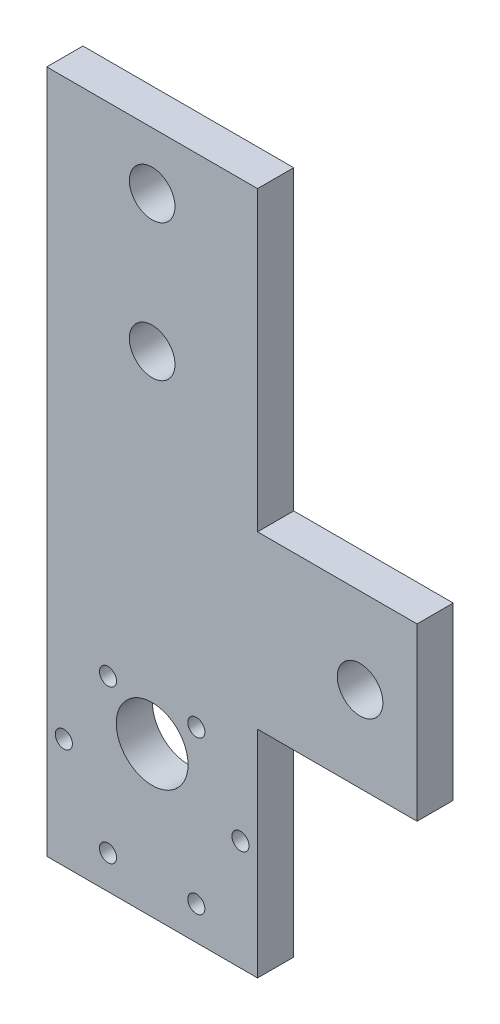
ISO-10303-21;
HEADER;
FILE_DESCRIPTION(('STEP AP214'),'2;1');
FILE_NAME('part.step','',(''),(''),'','','');
FILE_SCHEMA(('AUTOMOTIVE_DESIGN { 1 0 10303 214 1 1 1 1 }'));
ENDSEC;
DATA;
#1=APPLICATION_CONTEXT('core data for automotive mechanical design processes');
#2=APPLICATION_PROTOCOL_DEFINITION('international standard','automotive_design',2000,#1);
#3=PRODUCT_CONTEXT('',#1,'mechanical');
#4=PRODUCT('Part','Part','',(#3));
#5=PRODUCT_RELATED_PRODUCT_CATEGORY('part','',(#4));
#6=PRODUCT_DEFINITION_FORMATION('','',#4);
#7=PRODUCT_DEFINITION_CONTEXT('part definition',#1,'design');
#8=PRODUCT_DEFINITION('design','',#6,#7);
#9=PRODUCT_DEFINITION_SHAPE('','',#8);
#10=(LENGTH_UNIT() NAMED_UNIT(*) SI_UNIT(.MILLI.,.METRE.));
#11=(NAMED_UNIT(*) PLANE_ANGLE_UNIT() SI_UNIT($,.RADIAN.));
#12=(NAMED_UNIT(*) SI_UNIT($,.STERADIAN.) SOLID_ANGLE_UNIT());
#13=UNCERTAINTY_MEASURE_WITH_UNIT(LENGTH_MEASURE(1.E-05),#10,'distance_accuracy_value','');
#14=(GEOMETRIC_REPRESENTATION_CONTEXT(3) GLOBAL_UNCERTAINTY_ASSIGNED_CONTEXT((#13)) GLOBAL_UNIT_ASSIGNED_CONTEXT((#10,
#11,#12)) REPRESENTATION_CONTEXT('',''));
#15=CARTESIAN_POINT('',(0.,0.,0.));
#16=DIRECTION('',(0.,0.,1.));
#17=DIRECTION('',(1.,0.,0.));
#18=AXIS2_PLACEMENT_3D('',#15,#16,#17);
#19=CARTESIAN_POINT('',(0.,0.,6.35));
#20=DIRECTION('',(0.,0.,1.));
#21=DIRECTION('',(1.,0.,0.));
#22=AXIS2_PLACEMENT_3D('',#19,#20,#21);
#23=PLANE('',#22);
#24=CARTESIAN_POINT('',(0.,66.675,6.35));
#25=DIRECTION('',(0.,0.,1.));
#26=DIRECTION('',(1.,0.,0.));
#27=AXIS2_PLACEMENT_3D('',#24,#25,#26);
#28=CIRCLE('',#27,4.00000000000001);
#29=CARTESIAN_POINT('',(4.00000000000001,66.675,6.35));
#30=VERTEX_POINT('',#29);
#31=EDGE_CURVE('E227',#30,#30,#28,.T.);
#32=ORIENTED_EDGE('',*,*,#31,.F.);
#33=EDGE_LOOP('',(#32));
#34=FACE_BOUND('',#33,.T.);
#35=CARTESIAN_POINT('',(-15.5,0.,6.35));
#36=DIRECTION('',(0.,0.,1.));
#37=DIRECTION('',(1.,0.,0.));
#38=AXIS2_PLACEMENT_3D('',#35,#36,#37);
#39=CIRCLE('',#38,1.5);
#40=CARTESIAN_POINT('',(-14.,0.,6.35));
#41=VERTEX_POINT('',#40);
#42=EDGE_CURVE('E215',#41,#41,#39,.T.);
#43=ORIENTED_EDGE('',*,*,#42,.F.);
#44=EDGE_LOOP('',(#43));
#45=FACE_BOUND('',#44,.T.);
#46=CARTESIAN_POINT('',(7.75,-13.4233937586588,6.35));
#47=DIRECTION('',(0.,0.,1.));
#48=DIRECTION('',(1.,0.,0.));
#49=AXIS2_PLACEMENT_3D('',#46,#47,#48);
#50=CIRCLE('',#49,1.5);
#51=CARTESIAN_POINT('',(9.25,-13.4233937586588,6.35));
#52=VERTEX_POINT('',#51);
#53=EDGE_CURVE('E203',#52,#52,#50,.T.);
#54=ORIENTED_EDGE('',*,*,#53,.F.);
#55=EDGE_LOOP('',(#54));
#56=FACE_BOUND('',#55,.T.);
#57=CARTESIAN_POINT('',(7.75,13.4233937586588,6.35));
#58=DIRECTION('',(0.,0.,1.));
#59=DIRECTION('',(1.,0.,0.));
#60=AXIS2_PLACEMENT_3D('',#57,#58,#59);
#61=CIRCLE('',#60,1.5);
#62=CARTESIAN_POINT('',(9.25,13.4233937586588,6.35));
#63=VERTEX_POINT('',#62);
#64=EDGE_CURVE('E191',#63,#63,#61,.T.);
#65=ORIENTED_EDGE('',*,*,#64,.F.);
#66=EDGE_LOOP('',(#65));
#67=FACE_BOUND('',#66,.T.);
#68=CARTESIAN_POINT('',(0.,6.99999999999999,6.35));
#69=DIRECTION('',(0.,0.,1.));
#70=DIRECTION('',(1.,0.,0.));
#71=AXIS2_PLACEMENT_3D('',#68,#69,#70);
#72=CIRCLE('',#71,6.3);
#73=CARTESIAN_POINT('',(6.3,6.99999999999999,6.35));
#74=VERTEX_POINT('',#73);
#75=EDGE_CURVE('E137',#74,#74,#72,.T.);
#76=ORIENTED_EDGE('',*,*,#75,.F.);
#77=EDGE_LOOP('',(#76));
#78=FACE_BOUND('',#77,.T.);
#79=DIRECTION('',(0.,-1.,0.));
#80=VECTOR('',#79,1.);
#81=CARTESIAN_POINT('',(-18.5,100.675,6.35));
#82=LINE('',#81,#80);
#83=CARTESIAN_POINT('',(-18.5,100.675,6.35));
#84=VERTEX_POINT('',#83);
#85=CARTESIAN_POINT('',(-18.5,-19.325,6.35));
#86=VERTEX_POINT('',#85);
#87=EDGE_CURVE('E148',#84,#86,#82,.T.);
#88=ORIENTED_EDGE('',*,*,#87,.T.);
#89=DIRECTION('',(1.,0.,0.));
#90=VECTOR('',#89,1.);
#91=CARTESIAN_POINT('',(-18.5,-19.325,6.35));
#92=LINE('',#91,#90);
#93=CARTESIAN_POINT('',(18.5,-19.325,6.35));
#94=VERTEX_POINT('',#93);
#95=EDGE_CURVE('E96',#86,#94,#92,.T.);
#96=ORIENTED_EDGE('',*,*,#95,.T.);
#97=DIRECTION('',(0.,1.,0.));
#98=VECTOR('',#97,1.);
#99=CARTESIAN_POINT('',(18.5,18.5,6.35));
#100=LINE('',#99,#98);
#101=CARTESIAN_POINT('',(18.5,18.5,6.35));
#102=VERTEX_POINT('',#101);
#103=EDGE_CURVE('E163',#94,#102,#100,.T.);
#104=ORIENTED_EDGE('',*,*,#103,.T.);
#105=DIRECTION('',(1.,0.,0.));
#106=VECTOR('',#105,1.);
#107=CARTESIAN_POINT('',(18.5,18.5,6.35));
#108=LINE('',#107,#106);
#109=CARTESIAN_POINT('',(46.5,18.5,6.35));
#110=VERTEX_POINT('',#109);
#111=EDGE_CURVE('E176',#102,#110,#108,.T.);
#112=ORIENTED_EDGE('',*,*,#111,.T.);
#113=DIRECTION('',(0.,1.,0.));
#114=VECTOR('',#113,1.);
#115=CARTESIAN_POINT('',(46.5,48.5,6.35));
#116=LINE('',#115,#114);
#117=CARTESIAN_POINT('',(46.5,48.5,6.35));
#118=VERTEX_POINT('',#117);
#119=EDGE_CURVE('E115',#110,#118,#116,.T.);
#120=ORIENTED_EDGE('',*,*,#119,.T.);
#121=DIRECTION('',(-1.,0.,0.));
#122=VECTOR('',#121,1.);
#123=CARTESIAN_POINT('',(18.5,48.5,6.35));
#124=LINE('',#123,#122);
#125=CARTESIAN_POINT('',(18.5,48.5,6.35));
#126=VERTEX_POINT('',#125);
#127=EDGE_CURVE('E109',#118,#126,#124,.T.);
#128=ORIENTED_EDGE('',*,*,#127,.T.);
#129=DIRECTION('',(0.,1.,0.));
#130=VECTOR('',#129,1.);
#131=CARTESIAN_POINT('',(18.5,100.675,6.35));
#132=LINE('',#131,#130);
#133=CARTESIAN_POINT('',(18.5,100.675,6.35));
#134=VERTEX_POINT('',#133);
#135=EDGE_CURVE('E113',#126,#134,#132,.T.);
#136=ORIENTED_EDGE('',*,*,#135,.T.);
#137=DIRECTION('',(-1.,0.,0.));
#138=VECTOR('',#137,1.);
#139=CARTESIAN_POINT('',(-18.5,100.675,6.35));
#140=LINE('',#139,#138);
#141=EDGE_CURVE('E53',#134,#84,#140,.T.);
#142=ORIENTED_EDGE('',*,*,#141,.T.);
#143=EDGE_LOOP('',(#88,#96,#104,#112,#120,#128,#136,#142));
#144=FACE_BOUND('',#143,.T.);
#145=CARTESIAN_POINT('',(-7.75,13.4233937586588,6.35));
#146=DIRECTION('',(0.,0.,1.));
#147=DIRECTION('',(1.,0.,0.));
#148=AXIS2_PLACEMENT_3D('',#145,#146,#147);
#149=CIRCLE('',#148,1.5);
#150=CARTESIAN_POINT('',(-6.25,13.4233937586588,6.35));
#151=VERTEX_POINT('',#150);
#152=EDGE_CURVE('E185',#151,#151,#149,.T.);
#153=ORIENTED_EDGE('',*,*,#152,.F.);
#154=EDGE_LOOP('',(#153));
#155=FACE_BOUND('',#154,.T.);
#156=CARTESIAN_POINT('',(15.5,0.,6.35));
#157=DIRECTION('',(0.,0.,1.));
#158=DIRECTION('',(1.,0.,0.));
#159=AXIS2_PLACEMENT_3D('',#156,#157,#158);
#160=CIRCLE('',#159,1.5);
#161=CARTESIAN_POINT('',(17.,0.,6.35));
#162=VERTEX_POINT('',#161);
#163=EDGE_CURVE('E197',#162,#162,#160,.T.);
#164=ORIENTED_EDGE('',*,*,#163,.F.);
#165=EDGE_LOOP('',(#164));
#166=FACE_BOUND('',#165,.T.);
#167=CARTESIAN_POINT('',(-7.75,-13.4233937586588,6.35));
#168=DIRECTION('',(0.,0.,1.));
#169=DIRECTION('',(1.,0.,0.));
#170=AXIS2_PLACEMENT_3D('',#167,#168,#169);
#171=CIRCLE('',#170,1.5);
#172=CARTESIAN_POINT('',(-6.25,-13.4233937586588,6.35));
#173=VERTEX_POINT('',#172);
#174=EDGE_CURVE('E209',#173,#173,#171,.T.);
#175=ORIENTED_EDGE('',*,*,#174,.F.);
#176=EDGE_LOOP('',(#175));
#177=FACE_BOUND('',#176,.T.);
#178=CARTESIAN_POINT('',(0.,90.675,6.35));
#179=DIRECTION('',(0.,0.,1.));
#180=DIRECTION('',(1.,0.,0.));
#181=AXIS2_PLACEMENT_3D('',#178,#179,#180);
#182=CIRCLE('',#181,4.00000000000001);
#183=CARTESIAN_POINT('',(4.00000000000001,90.675,6.35));
#184=VERTEX_POINT('',#183);
#185=EDGE_CURVE('E221',#184,#184,#182,.T.);
#186=ORIENTED_EDGE('',*,*,#185,.F.);
#187=EDGE_LOOP('',(#186));
#188=FACE_BOUND('',#187,.T.);
#189=CARTESIAN_POINT('',(36.5,33.5,6.35));
#190=DIRECTION('',(0.,0.,1.));
#191=DIRECTION('',(1.,0.,0.));
#192=AXIS2_PLACEMENT_3D('',#189,#190,#191);
#193=CIRCLE('',#192,4.00000000000001);
#194=CARTESIAN_POINT('',(40.5,33.5,6.35));
#195=VERTEX_POINT('',#194);
#196=EDGE_CURVE('E233',#195,#195,#193,.T.);
#197=ORIENTED_EDGE('',*,*,#196,.F.);
#198=EDGE_LOOP('',(#197));
#199=FACE_BOUND('',#198,.T.);
#200=ADVANCED_FACE('F36',(#34,#45,#56,#67,#78,#144,#155,#166,#177,#188,#199),#23,.T.);
#201=CARTESIAN_POINT('',(0.,0.,0.));
#202=DIRECTION('',(0.,0.,1.));
#203=DIRECTION('',(1.,0.,0.));
#204=AXIS2_PLACEMENT_3D('',#201,#202,#203);
#205=PLANE('',#204);
#206=DIRECTION('',(0.,-1.,0.));
#207=VECTOR('',#206,1.);
#208=CARTESIAN_POINT('',(-18.5,100.675,0.));
#209=LINE('',#208,#207);
#210=CARTESIAN_POINT('',(-18.5,100.675,0.));
#211=VERTEX_POINT('',#210);
#212=CARTESIAN_POINT('',(-18.5,-19.325,0.));
#213=VERTEX_POINT('',#212);
#214=EDGE_CURVE('E133',#211,#213,#209,.T.);
#215=ORIENTED_EDGE('',*,*,#214,.F.);
#216=DIRECTION('',(-1.,0.,0.));
#217=VECTOR('',#216,1.);
#218=CARTESIAN_POINT('',(-18.5,100.675,0.));
#219=LINE('',#218,#217);
#220=CARTESIAN_POINT('',(18.5,100.675,0.));
#221=VERTEX_POINT('',#220);
#222=EDGE_CURVE('E88',#221,#211,#219,.T.);
#223=ORIENTED_EDGE('',*,*,#222,.F.);
#224=DIRECTION('',(0.,1.,0.));
#225=VECTOR('',#224,1.);
#226=CARTESIAN_POINT('',(18.5,100.675,0.));
#227=LINE('',#226,#225);
#228=CARTESIAN_POINT('',(18.5,48.5,0.));
#229=VERTEX_POINT('',#228);
#230=EDGE_CURVE('E82',#229,#221,#227,.T.);
#231=ORIENTED_EDGE('',*,*,#230,.F.);
#232=DIRECTION('',(-1.,0.,0.));
#233=VECTOR('',#232,1.);
#234=CARTESIAN_POINT('',(18.5,48.5,0.));
#235=LINE('',#234,#233);
#236=CARTESIAN_POINT('',(46.5,48.5,0.));
#237=VERTEX_POINT('',#236);
#238=EDGE_CURVE('E123',#237,#229,#235,.T.);
#239=ORIENTED_EDGE('',*,*,#238,.F.);
#240=DIRECTION('',(0.,1.,0.));
#241=VECTOR('',#240,1.);
#242=CARTESIAN_POINT('',(46.5,48.5,0.));
#243=LINE('',#242,#241);
#244=CARTESIAN_POINT('',(46.5,18.5,0.));
#245=VERTEX_POINT('',#244);
#246=EDGE_CURVE('E143',#245,#237,#243,.T.);
#247=ORIENTED_EDGE('',*,*,#246,.F.);
#248=DIRECTION('',(1.,0.,0.));
#249=VECTOR('',#248,1.);
#250=CARTESIAN_POINT('',(18.5,18.5,0.));
#251=LINE('',#250,#249);
#252=CARTESIAN_POINT('',(18.5,18.5,0.));
#253=VERTEX_POINT('',#252);
#254=EDGE_CURVE('E141',#253,#245,#251,.T.);
#255=ORIENTED_EDGE('',*,*,#254,.F.);
#256=DIRECTION('',(0.,1.,0.));
#257=VECTOR('',#256,1.);
#258=CARTESIAN_POINT('',(18.5,18.5,0.));
#259=LINE('',#258,#257);
#260=CARTESIAN_POINT('',(18.5,-19.325,0.));
#261=VERTEX_POINT('',#260);
#262=EDGE_CURVE('E139',#261,#253,#259,.T.);
#263=ORIENTED_EDGE('',*,*,#262,.F.);
#264=DIRECTION('',(1.,0.,0.));
#265=VECTOR('',#264,1.);
#266=CARTESIAN_POINT('',(-18.5,-19.325,0.));
#267=LINE('',#266,#265);
#268=EDGE_CURVE('E136',#213,#261,#267,.T.);
#269=ORIENTED_EDGE('',*,*,#268,.F.);
#270=EDGE_LOOP('',(#215,#223,#231,#239,#247,#255,#263,#269));
#271=FACE_BOUND('',#270,.T.);
#272=CARTESIAN_POINT('',(0.,6.99999999999999,0.));
#273=DIRECTION('',(0.,0.,1.));
#274=DIRECTION('',(1.,0.,0.));
#275=AXIS2_PLACEMENT_3D('',#272,#273,#274);
#276=CIRCLE('',#275,6.3);
#277=CARTESIAN_POINT('',(6.3,6.99999999999999,0.));
#278=VERTEX_POINT('',#277);
#279=EDGE_CURVE('E182',#278,#278,#276,.T.);
#280=ORIENTED_EDGE('',*,*,#279,.T.);
#281=EDGE_LOOP('',(#280));
#282=FACE_BOUND('',#281,.T.);
#283=CARTESIAN_POINT('',(-7.75,13.4233937586588,0.));
#284=DIRECTION('',(0.,0.,1.));
#285=DIRECTION('',(1.,0.,0.));
#286=AXIS2_PLACEMENT_3D('',#283,#284,#285);
#287=CIRCLE('',#286,1.5);
#288=CARTESIAN_POINT('',(-6.25,13.4233937586588,0.));
#289=VERTEX_POINT('',#288);
#290=EDGE_CURVE('E188',#289,#289,#287,.T.);
#291=ORIENTED_EDGE('',*,*,#290,.T.);
#292=EDGE_LOOP('',(#291));
#293=FACE_BOUND('',#292,.T.);
#294=CARTESIAN_POINT('',(7.75,13.4233937586588,0.));
#295=DIRECTION('',(0.,0.,1.));
#296=DIRECTION('',(1.,0.,0.));
#297=AXIS2_PLACEMENT_3D('',#294,#295,#296);
#298=CIRCLE('',#297,1.5);
#299=CARTESIAN_POINT('',(9.25,13.4233937586588,0.));
#300=VERTEX_POINT('',#299);
#301=EDGE_CURVE('E194',#300,#300,#298,.T.);
#302=ORIENTED_EDGE('',*,*,#301,.T.);
#303=EDGE_LOOP('',(#302));
#304=FACE_BOUND('',#303,.T.);
#305=CARTESIAN_POINT('',(15.5,0.,0.));
#306=DIRECTION('',(0.,0.,1.));
#307=DIRECTION('',(1.,0.,0.));
#308=AXIS2_PLACEMENT_3D('',#305,#306,#307);
#309=CIRCLE('',#308,1.5);
#310=CARTESIAN_POINT('',(17.,0.,0.));
#311=VERTEX_POINT('',#310);
#312=EDGE_CURVE('E200',#311,#311,#309,.T.);
#313=ORIENTED_EDGE('',*,*,#312,.T.);
#314=EDGE_LOOP('',(#313));
#315=FACE_BOUND('',#314,.T.);
#316=CARTESIAN_POINT('',(7.75,-13.4233937586588,0.));
#317=DIRECTION('',(0.,0.,1.));
#318=DIRECTION('',(1.,0.,0.));
#319=AXIS2_PLACEMENT_3D('',#316,#317,#318);
#320=CIRCLE('',#319,1.5);
#321=CARTESIAN_POINT('',(9.25,-13.4233937586588,0.));
#322=VERTEX_POINT('',#321);
#323=EDGE_CURVE('E206',#322,#322,#320,.T.);
#324=ORIENTED_EDGE('',*,*,#323,.T.);
#325=EDGE_LOOP('',(#324));
#326=FACE_BOUND('',#325,.T.);
#327=CARTESIAN_POINT('',(-7.75,-13.4233937586588,0.));
#328=DIRECTION('',(0.,0.,1.));
#329=DIRECTION('',(1.,0.,0.));
#330=AXIS2_PLACEMENT_3D('',#327,#328,#329);
#331=CIRCLE('',#330,1.5);
#332=CARTESIAN_POINT('',(-6.25,-13.4233937586588,0.));
#333=VERTEX_POINT('',#332);
#334=EDGE_CURVE('E212',#333,#333,#331,.T.);
#335=ORIENTED_EDGE('',*,*,#334,.T.);
#336=EDGE_LOOP('',(#335));
#337=FACE_BOUND('',#336,.T.);
#338=CARTESIAN_POINT('',(-15.5,0.,0.));
#339=DIRECTION('',(0.,0.,1.));
#340=DIRECTION('',(1.,0.,0.));
#341=AXIS2_PLACEMENT_3D('',#338,#339,#340);
#342=CIRCLE('',#341,1.5);
#343=CARTESIAN_POINT('',(-14.,0.,0.));
#344=VERTEX_POINT('',#343);
#345=EDGE_CURVE('E218',#344,#344,#342,.T.);
#346=ORIENTED_EDGE('',*,*,#345,.T.);
#347=EDGE_LOOP('',(#346));
#348=FACE_BOUND('',#347,.T.);
#349=CARTESIAN_POINT('',(0.,90.675,0.));
#350=DIRECTION('',(0.,0.,1.));
#351=DIRECTION('',(1.,0.,0.));
#352=AXIS2_PLACEMENT_3D('',#349,#350,#351);
#353=CIRCLE('',#352,4.00000000000001);
#354=CARTESIAN_POINT('',(4.00000000000001,90.675,0.));
#355=VERTEX_POINT('',#354);
#356=EDGE_CURVE('E224',#355,#355,#353,.T.);
#357=ORIENTED_EDGE('',*,*,#356,.T.);
#358=EDGE_LOOP('',(#357));
#359=FACE_BOUND('',#358,.T.);
#360=CARTESIAN_POINT('',(0.,66.675,0.));
#361=DIRECTION('',(0.,0.,1.));
#362=DIRECTION('',(1.,0.,0.));
#363=AXIS2_PLACEMENT_3D('',#360,#361,#362);
#364=CIRCLE('',#363,4.00000000000001);
#365=CARTESIAN_POINT('',(4.00000000000001,66.675,0.));
#366=VERTEX_POINT('',#365);
#367=EDGE_CURVE('E230',#366,#366,#364,.T.);
#368=ORIENTED_EDGE('',*,*,#367,.T.);
#369=EDGE_LOOP('',(#368));
#370=FACE_BOUND('',#369,.T.);
#371=CARTESIAN_POINT('',(36.5,33.5,0.));
#372=DIRECTION('',(0.,0.,1.));
#373=DIRECTION('',(1.,0.,0.));
#374=AXIS2_PLACEMENT_3D('',#371,#372,#373);
#375=CIRCLE('',#374,4.00000000000001);
#376=CARTESIAN_POINT('',(40.5,33.5,0.));
#377=VERTEX_POINT('',#376);
#378=EDGE_CURVE('E236',#377,#377,#375,.T.);
#379=ORIENTED_EDGE('',*,*,#378,.T.);
#380=EDGE_LOOP('',(#379));
#381=FACE_BOUND('',#380,.T.);
#382=ADVANCED_FACE('F167',(#271,#282,#293,#304,#315,#326,#337,#348,#359,#370,#381),#205,.F.);
#383=CARTESIAN_POINT('',(-18.5,100.675,6.35));
#384=DIRECTION('',(1.,0.,0.));
#385=DIRECTION('',(0.,1.,0.));
#386=AXIS2_PLACEMENT_3D('',#383,#384,#385);
#387=PLANE('',#386);
#388=ORIENTED_EDGE('',*,*,#214,.T.);
#389=DIRECTION('',(0.,0.,-1.));
#390=VECTOR('',#389,1.);
#391=CARTESIAN_POINT('',(-18.5,-19.325,6.35));
#392=LINE('',#391,#390);
#393=EDGE_CURVE('E11',#86,#213,#392,.T.);
#394=ORIENTED_EDGE('',*,*,#393,.F.);
#395=ORIENTED_EDGE('',*,*,#87,.F.);
#396=DIRECTION('',(0.,0.,-1.));
#397=VECTOR('',#396,1.);
#398=CARTESIAN_POINT('',(-18.5,100.675,6.35));
#399=LINE('',#398,#397);
#400=EDGE_CURVE('E129',#84,#211,#399,.T.);
#401=ORIENTED_EDGE('',*,*,#400,.T.);
#402=EDGE_LOOP('',(#388,#394,#395,#401));
#403=FACE_BOUND('',#402,.T.);
#404=ADVANCED_FACE('F38',(#403),#387,.F.);
#405=CARTESIAN_POINT('',(-18.5,-19.325,6.35));
#406=DIRECTION('',(0.,1.,0.));
#407=DIRECTION('',(0.,0.,1.));
#408=AXIS2_PLACEMENT_3D('',#405,#406,#407);
#409=PLANE('',#408);
#410=ORIENTED_EDGE('',*,*,#268,.T.);
#411=DIRECTION('',(0.,0.,-1.));
#412=VECTOR('',#411,1.);
#413=CARTESIAN_POINT('',(18.5,-19.325,6.35));
#414=LINE('',#413,#412);
#415=EDGE_CURVE('E45',#94,#261,#414,.T.);
#416=ORIENTED_EDGE('',*,*,#415,.F.);
#417=ORIENTED_EDGE('',*,*,#95,.F.);
#418=ORIENTED_EDGE('',*,*,#393,.T.);
#419=EDGE_LOOP('',(#410,#416,#417,#418));
#420=FACE_BOUND('',#419,.T.);
#421=ADVANCED_FACE('F270',(#420),#409,.F.);
#422=CARTESIAN_POINT('',(18.5,18.5,6.35));
#423=DIRECTION('',(-1.,0.,0.));
#424=DIRECTION('',(0.,-1.,0.));
#425=AXIS2_PLACEMENT_3D('',#422,#423,#424);
#426=PLANE('',#425);
#427=ORIENTED_EDGE('',*,*,#262,.T.);
#428=DIRECTION('',(0.,0.,-1.));
#429=VECTOR('',#428,1.);
#430=CARTESIAN_POINT('',(18.5,18.5,6.35));
#431=LINE('',#430,#429);
#432=EDGE_CURVE('E155',#102,#253,#431,.T.);
#433=ORIENTED_EDGE('',*,*,#432,.F.);
#434=ORIENTED_EDGE('',*,*,#103,.F.);
#435=ORIENTED_EDGE('',*,*,#415,.T.);
#436=EDGE_LOOP('',(#427,#433,#434,#435));
#437=FACE_BOUND('',#436,.T.);
#438=ADVANCED_FACE('F161',(#437),#426,.F.);
#439=CARTESIAN_POINT('',(18.5,18.5,6.35));
#440=DIRECTION('',(0.,1.,0.));
#441=DIRECTION('',(-1.,0.,0.));
#442=AXIS2_PLACEMENT_3D('',#439,#440,#441);
#443=PLANE('',#442);
#444=ORIENTED_EDGE('',*,*,#254,.T.);
#445=DIRECTION('',(0.,0.,-1.));
#446=VECTOR('',#445,1.);
#447=CARTESIAN_POINT('',(46.5,18.5,6.35));
#448=LINE('',#447,#446);
#449=EDGE_CURVE('E152',#110,#245,#448,.T.);
#450=ORIENTED_EDGE('',*,*,#449,.F.);
#451=ORIENTED_EDGE('',*,*,#111,.F.);
#452=ORIENTED_EDGE('',*,*,#432,.T.);
#453=EDGE_LOOP('',(#444,#450,#451,#452));
#454=FACE_BOUND('',#453,.T.);
#455=ADVANCED_FACE('F172',(#454),#443,.F.);
#456=CARTESIAN_POINT('',(46.5,48.5,6.35));
#457=DIRECTION('',(-1.,0.,0.));
#458=DIRECTION('',(0.,-1.,0.));
#459=AXIS2_PLACEMENT_3D('',#456,#457,#458);
#460=PLANE('',#459);
#461=ORIENTED_EDGE('',*,*,#246,.T.);
#462=DIRECTION('',(0.,0.,-1.));
#463=VECTOR('',#462,1.);
#464=CARTESIAN_POINT('',(46.5,48.5,6.35));
#465=LINE('',#464,#463);
#466=EDGE_CURVE('E124',#118,#237,#465,.T.);
#467=ORIENTED_EDGE('',*,*,#466,.F.);
#468=ORIENTED_EDGE('',*,*,#119,.F.);
#469=ORIENTED_EDGE('',*,*,#449,.T.);
#470=EDGE_LOOP('',(#461,#467,#468,#469));
#471=FACE_BOUND('',#470,.T.);
#472=ADVANCED_FACE('F175',(#471),#460,.F.);
#473=CARTESIAN_POINT('',(18.5,48.5,6.35));
#474=DIRECTION('',(0.,-1.,0.));
#475=DIRECTION('',(0.,0.,-1.));
#476=AXIS2_PLACEMENT_3D('',#473,#474,#475);
#477=PLANE('',#476);
#478=ORIENTED_EDGE('',*,*,#238,.T.);
#479=DIRECTION('',(0.,0.,-1.));
#480=VECTOR('',#479,1.);
#481=CARTESIAN_POINT('',(18.5,48.5,6.35));
#482=LINE('',#481,#480);
#483=EDGE_CURVE('E120',#126,#229,#482,.T.);
#484=ORIENTED_EDGE('',*,*,#483,.F.);
#485=ORIENTED_EDGE('',*,*,#127,.F.);
#486=ORIENTED_EDGE('',*,*,#466,.T.);
#487=EDGE_LOOP('',(#478,#484,#485,#486));
#488=FACE_BOUND('',#487,.T.);
#489=ADVANCED_FACE('F121',(#488),#477,.F.);
#490=CARTESIAN_POINT('',(18.5,100.675,6.35));
#491=DIRECTION('',(-1.,0.,0.));
#492=DIRECTION('',(0.,-1.,0.));
#493=AXIS2_PLACEMENT_3D('',#490,#491,#492);
#494=PLANE('',#493);
#495=ORIENTED_EDGE('',*,*,#230,.T.);
#496=DIRECTION('',(0.,0.,-1.));
#497=VECTOR('',#496,1.);
#498=CARTESIAN_POINT('',(18.5,100.675,6.35));
#499=LINE('',#498,#497);
#500=EDGE_CURVE('E125',#134,#221,#499,.T.);
#501=ORIENTED_EDGE('',*,*,#500,.F.);
#502=ORIENTED_EDGE('',*,*,#135,.F.);
#503=ORIENTED_EDGE('',*,*,#483,.T.);
#504=EDGE_LOOP('',(#495,#501,#502,#503));
#505=FACE_BOUND('',#504,.T.);
#506=ADVANCED_FACE('F127',(#505),#494,.F.);
#507=CARTESIAN_POINT('',(-18.5,100.675,6.35));
#508=DIRECTION('',(0.,-1.,0.));
#509=DIRECTION('',(0.,0.,-1.));
#510=AXIS2_PLACEMENT_3D('',#507,#508,#509);
#511=PLANE('',#510);
#512=ORIENTED_EDGE('',*,*,#222,.T.);
#513=ORIENTED_EDGE('',*,*,#400,.F.);
#514=ORIENTED_EDGE('',*,*,#141,.F.);
#515=ORIENTED_EDGE('',*,*,#500,.T.);
#516=EDGE_LOOP('',(#512,#513,#514,#515));
#517=FACE_BOUND('',#516,.T.);
#518=ADVANCED_FACE('F258',(#517),#511,.F.);
#519=CARTESIAN_POINT('',(0.,6.99999999999999,6.35));
#520=DIRECTION('',(0.,0.,-1.));
#521=DIRECTION('',(-1.,0.,0.));
#522=AXIS2_PLACEMENT_3D('',#519,#520,#521);
#523=CYLINDRICAL_SURFACE('',#522,6.3);
#524=ORIENTED_EDGE('',*,*,#75,.T.);
#525=EDGE_LOOP('',(#524));
#526=FACE_BOUND('',#525,.T.);
#527=ORIENTED_EDGE('',*,*,#279,.F.);
#528=EDGE_LOOP('',(#527));
#529=FACE_BOUND('',#528,.T.);
#530=ADVANCED_FACE('F255',(#526,#529),#523,.F.);
#531=CARTESIAN_POINT('',(-7.75,13.4233937586588,6.35));
#532=DIRECTION('',(0.,0.,-1.));
#533=DIRECTION('',(-1.,0.,0.));
#534=AXIS2_PLACEMENT_3D('',#531,#532,#533);
#535=CYLINDRICAL_SURFACE('',#534,1.5);
#536=ORIENTED_EDGE('',*,*,#152,.T.);
#537=EDGE_LOOP('',(#536));
#538=FACE_BOUND('',#537,.T.);
#539=ORIENTED_EDGE('',*,*,#290,.F.);
#540=EDGE_LOOP('',(#539));
#541=FACE_BOUND('',#540,.T.);
#542=ADVANCED_FACE('F334',(#538,#541),#535,.F.);
#543=CARTESIAN_POINT('',(7.75,13.4233937586588,6.35));
#544=DIRECTION('',(0.,0.,-1.));
#545=DIRECTION('',(-1.,0.,0.));
#546=AXIS2_PLACEMENT_3D('',#543,#544,#545);
#547=CYLINDRICAL_SURFACE('',#546,1.5);
#548=ORIENTED_EDGE('',*,*,#64,.T.);
#549=EDGE_LOOP('',(#548));
#550=FACE_BOUND('',#549,.T.);
#551=ORIENTED_EDGE('',*,*,#301,.F.);
#552=EDGE_LOOP('',(#551));
#553=FACE_BOUND('',#552,.T.);
#554=ADVANCED_FACE('F342',(#550,#553),#547,.F.);
#555=CARTESIAN_POINT('',(15.5,0.,6.35));
#556=DIRECTION('',(0.,0.,-1.));
#557=DIRECTION('',(-1.,0.,0.));
#558=AXIS2_PLACEMENT_3D('',#555,#556,#557);
#559=CYLINDRICAL_SURFACE('',#558,1.5);
#560=ORIENTED_EDGE('',*,*,#163,.T.);
#561=EDGE_LOOP('',(#560));
#562=FACE_BOUND('',#561,.T.);
#563=ORIENTED_EDGE('',*,*,#312,.F.);
#564=EDGE_LOOP('',(#563));
#565=FACE_BOUND('',#564,.T.);
#566=ADVANCED_FACE('F350',(#562,#565),#559,.F.);
#567=CARTESIAN_POINT('',(7.75,-13.4233937586588,6.35));
#568=DIRECTION('',(0.,0.,-1.));
#569=DIRECTION('',(-1.,0.,0.));
#570=AXIS2_PLACEMENT_3D('',#567,#568,#569);
#571=CYLINDRICAL_SURFACE('',#570,1.5);
#572=ORIENTED_EDGE('',*,*,#53,.T.);
#573=EDGE_LOOP('',(#572));
#574=FACE_BOUND('',#573,.T.);
#575=ORIENTED_EDGE('',*,*,#323,.F.);
#576=EDGE_LOOP('',(#575));
#577=FACE_BOUND('',#576,.T.);
#578=ADVANCED_FACE('F359',(#574,#577),#571,.F.);
#579=CARTESIAN_POINT('',(-7.75,-13.4233937586588,6.35));
#580=DIRECTION('',(0.,0.,-1.));
#581=DIRECTION('',(-1.,0.,0.));
#582=AXIS2_PLACEMENT_3D('',#579,#580,#581);
#583=CYLINDRICAL_SURFACE('',#582,1.5);
#584=ORIENTED_EDGE('',*,*,#174,.T.);
#585=EDGE_LOOP('',(#584));
#586=FACE_BOUND('',#585,.T.);
#587=ORIENTED_EDGE('',*,*,#334,.F.);
#588=EDGE_LOOP('',(#587));
#589=FACE_BOUND('',#588,.T.);
#590=ADVANCED_FACE('F368',(#586,#589),#583,.F.);
#591=CARTESIAN_POINT('',(-15.5,0.,6.35));
#592=DIRECTION('',(0.,0.,-1.));
#593=DIRECTION('',(-1.,0.,0.));
#594=AXIS2_PLACEMENT_3D('',#591,#592,#593);
#595=CYLINDRICAL_SURFACE('',#594,1.5);
#596=ORIENTED_EDGE('',*,*,#42,.T.);
#597=EDGE_LOOP('',(#596));
#598=FACE_BOUND('',#597,.T.);
#599=ORIENTED_EDGE('',*,*,#345,.F.);
#600=EDGE_LOOP('',(#599));
#601=FACE_BOUND('',#600,.T.);
#602=ADVANCED_FACE('F377',(#598,#601),#595,.F.);
#603=CARTESIAN_POINT('',(0.,90.675,6.35));
#604=DIRECTION('',(0.,0.,-1.));
#605=DIRECTION('',(-1.,0.,0.));
#606=AXIS2_PLACEMENT_3D('',#603,#604,#605);
#607=CYLINDRICAL_SURFACE('',#606,4.00000000000001);
#608=ORIENTED_EDGE('',*,*,#185,.T.);
#609=EDGE_LOOP('',(#608));
#610=FACE_BOUND('',#609,.T.);
#611=ORIENTED_EDGE('',*,*,#356,.F.);
#612=EDGE_LOOP('',(#611));
#613=FACE_BOUND('',#612,.T.);
#614=ADVANCED_FACE('F386',(#610,#613),#607,.F.);
#615=CARTESIAN_POINT('',(0.,66.675,6.35));
#616=DIRECTION('',(0.,0.,-1.));
#617=DIRECTION('',(-1.,0.,0.));
#618=AXIS2_PLACEMENT_3D('',#615,#616,#617);
#619=CYLINDRICAL_SURFACE('',#618,4.00000000000001);
#620=ORIENTED_EDGE('',*,*,#31,.T.);
#621=EDGE_LOOP('',(#620));
#622=FACE_BOUND('',#621,.T.);
#623=ORIENTED_EDGE('',*,*,#367,.F.);
#624=EDGE_LOOP('',(#623));
#625=FACE_BOUND('',#624,.T.);
#626=ADVANCED_FACE('F395',(#622,#625),#619,.F.);
#627=CARTESIAN_POINT('',(36.5,33.5,6.35));
#628=DIRECTION('',(0.,0.,-1.));
#629=DIRECTION('',(-1.,0.,0.));
#630=AXIS2_PLACEMENT_3D('',#627,#628,#629);
#631=CYLINDRICAL_SURFACE('',#630,4.00000000000001);
#632=ORIENTED_EDGE('',*,*,#196,.T.);
#633=EDGE_LOOP('',(#632));
#634=FACE_BOUND('',#633,.T.);
#635=ORIENTED_EDGE('',*,*,#378,.F.);
#636=EDGE_LOOP('',(#635));
#637=FACE_BOUND('',#636,.T.);
#638=ADVANCED_FACE('F242',(#634,#637),#631,.F.);
#639=CLOSED_SHELL('',(#200,#382,#404,#421,#438,#455,#472,#489,#506,#518,#530,#542,#554,#566,
#578,#590,#602,#614,#626,#638));
#640=MANIFOLD_SOLID_BREP('B2',#639);
#641=ADVANCED_BREP_SHAPE_REPRESENTATION('',(#18,#640),#14);
#642=SHAPE_DEFINITION_REPRESENTATION(#9,#641);
ENDSEC;
END-ISO-10303-21;
